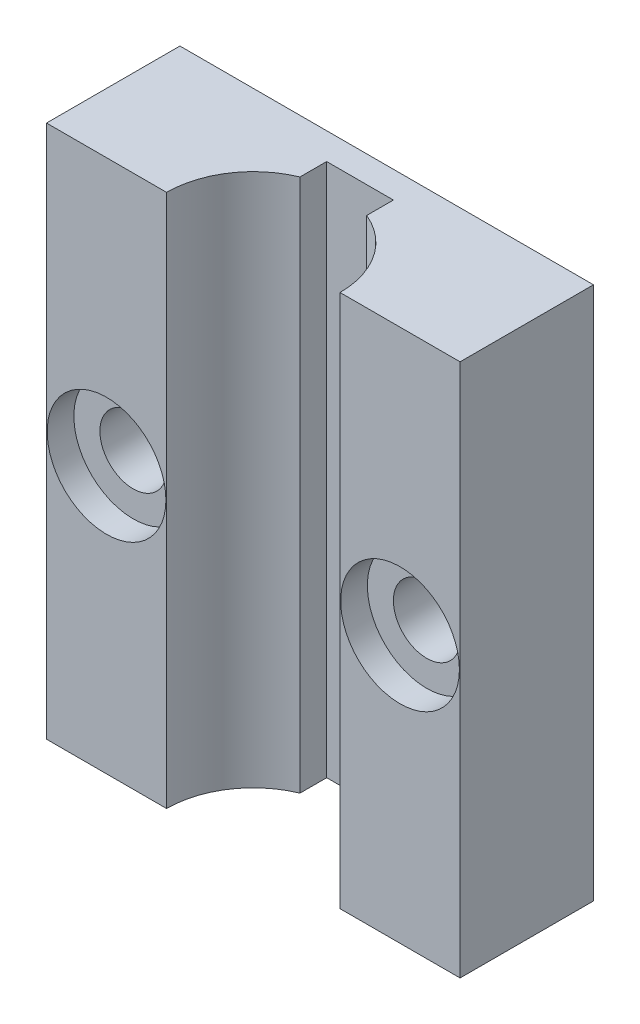
ISO-10303-21;
HEADER;
FILE_DESCRIPTION(('STEP AP214'),'2;1');
FILE_NAME('part.step','',(''),(''),'','','');
FILE_SCHEMA(('AUTOMOTIVE_DESIGN { 1 0 10303 214 1 1 1 1 }'));
ENDSEC;
DATA;
#1=APPLICATION_CONTEXT('core data for automotive mechanical design processes');
#2=APPLICATION_PROTOCOL_DEFINITION('international standard','automotive_design',2000,#1);
#3=PRODUCT_CONTEXT('',#1,'mechanical');
#4=PRODUCT('Part','Part','',(#3));
#5=PRODUCT_RELATED_PRODUCT_CATEGORY('part','',(#4));
#6=PRODUCT_DEFINITION_FORMATION('','',#4);
#7=PRODUCT_DEFINITION_CONTEXT('part definition',#1,'design');
#8=PRODUCT_DEFINITION('design','',#6,#7);
#9=PRODUCT_DEFINITION_SHAPE('','',#8);
#10=(LENGTH_UNIT() NAMED_UNIT(*) SI_UNIT(.MILLI.,.METRE.));
#11=(NAMED_UNIT(*) PLANE_ANGLE_UNIT() SI_UNIT($,.RADIAN.));
#12=(NAMED_UNIT(*) SI_UNIT($,.STERADIAN.) SOLID_ANGLE_UNIT());
#13=UNCERTAINTY_MEASURE_WITH_UNIT(LENGTH_MEASURE(1.E-05),#10,'distance_accuracy_value','');
#14=(GEOMETRIC_REPRESENTATION_CONTEXT(3) GLOBAL_UNCERTAINTY_ASSIGNED_CONTEXT((#13)) GLOBAL_UNIT_ASSIGNED_CONTEXT((#10,
#11,#12)) REPRESENTATION_CONTEXT('',''));
#15=CARTESIAN_POINT('',(0.,0.,0.));
#16=DIRECTION('',(0.,0.,1.));
#17=DIRECTION('',(1.,0.,0.));
#18=AXIS2_PLACEMENT_3D('',#15,#16,#17);
#19=CARTESIAN_POINT('',(-9.15448854262115,-16.4219409282701,10.));
#20=DIRECTION('',(0.,1.,0.));
#21=DIRECTION('',(0.,0.,1.));
#22=AXIS2_PLACEMENT_3D('',#19,#20,#21);
#23=CYLINDRICAL_SURFACE('',#22,6.5);
#24=CARTESIAN_POINT('',(-9.15448854262115,-16.4219409282701,10.));
#25=DIRECTION('',(0.,1.,0.));
#26=DIRECTION('',(0.,0.,1.));
#27=AXIS2_PLACEMENT_3D('',#24,#25,#26);
#28=CIRCLE('',#27,6.5);
#29=CARTESIAN_POINT('',(-11.6544885426211,-16.4219409282701,4.));
#30=VERTEX_POINT('',#29);
#31=CARTESIAN_POINT('',(-15.6544885426211,-16.4219409282701,10.));
#32=VERTEX_POINT('',#31);
#33=EDGE_CURVE('E168',#30,#32,#28,.T.);
#34=ORIENTED_EDGE('',*,*,#33,.F.);
#35=DIRECTION('',(0.,1.,0.));
#36=VECTOR('',#35,1.);
#37=CARTESIAN_POINT('',(-11.6544885426211,-16.4219409282701,4.));
#38=LINE('',#37,#36);
#39=CARTESIAN_POINT('',(-11.6544885426211,23.5780590717299,4.));
#40=VERTEX_POINT('',#39);
#41=EDGE_CURVE('E11',#30,#40,#38,.T.);
#42=ORIENTED_EDGE('',*,*,#41,.T.);
#43=CARTESIAN_POINT('',(-9.15448854262115,23.5780590717299,10.));
#44=DIRECTION('',(0.,1.,0.));
#45=DIRECTION('',(0.,0.,1.));
#46=AXIS2_PLACEMENT_3D('',#43,#44,#45);
#47=CIRCLE('',#46,6.5);
#48=CARTESIAN_POINT('',(-15.6544885426211,23.5780590717299,10.));
#49=VERTEX_POINT('',#48);
#50=EDGE_CURVE('E57',#40,#49,#47,.T.);
#51=ORIENTED_EDGE('',*,*,#50,.T.);
#52=DIRECTION('',(0.,1.,0.));
#53=VECTOR('',#52,1.);
#54=CARTESIAN_POINT('',(-15.6544885426211,-16.4219409282701,10.));
#55=LINE('',#54,#53);
#56=EDGE_CURVE('E206',#49,#32,#55,.F.);
#57=ORIENTED_EDGE('',*,*,#56,.T.);
#58=EDGE_LOOP('',(#34,#42,#51,#57));
#59=FACE_BOUND('',#58,.T.);
#60=ADVANCED_FACE('F35',(#59),#23,.F.);
#61=CARTESIAN_POINT('',(1.84551145737885,3.57805907172994,0.));
#62=DIRECTION('',(0.,0.,1.));
#63=DIRECTION('',(1.,0.,0.));
#64=AXIS2_PLACEMENT_3D('',#61,#62,#63);
#65=CYLINDRICAL_SURFACE('',#64,2.5);
#66=CARTESIAN_POINT('',(1.84551145737885,3.57805907172994,0.));
#67=DIRECTION('',(0.,0.,1.));
#68=DIRECTION('',(1.,0.,0.));
#69=AXIS2_PLACEMENT_3D('',#66,#67,#68);
#70=CIRCLE('',#69,2.5);
#71=CARTESIAN_POINT('',(4.34551145737885,3.57805907172994,0.));
#72=VERTEX_POINT('',#71);
#73=EDGE_CURVE('E151',#72,#72,#70,.T.);
#74=ORIENTED_EDGE('',*,*,#73,.F.);
#75=EDGE_LOOP('',(#74));
#76=FACE_BOUND('',#75,.T.);
#77=CARTESIAN_POINT('',(1.84551145737885,3.57805907172994,8.));
#78=DIRECTION('',(0.,0.,1.));
#79=DIRECTION('',(1.,0.,0.));
#80=AXIS2_PLACEMENT_3D('',#77,#78,#79);
#81=CIRCLE('',#80,2.5);
#82=CARTESIAN_POINT('',(4.34551145737885,3.57805907172994,8.));
#83=VERTEX_POINT('',#82);
#84=EDGE_CURVE('E141',#83,#83,#81,.T.);
#85=ORIENTED_EDGE('',*,*,#84,.T.);
#86=EDGE_LOOP('',(#85));
#87=FACE_BOUND('',#86,.T.);
#88=ADVANCED_FACE('F246',(#76,#87),#65,.F.);
#89=CARTESIAN_POINT('',(-20.1544885426211,3.57805907172994,0.));
#90=DIRECTION('',(0.,0.,1.));
#91=DIRECTION('',(1.,0.,0.));
#92=AXIS2_PLACEMENT_3D('',#89,#90,#91);
#93=CYLINDRICAL_SURFACE('',#92,2.5);
#94=CARTESIAN_POINT('',(-20.1544885426211,3.57805907172994,0.));
#95=DIRECTION('',(0.,0.,1.));
#96=DIRECTION('',(1.,0.,0.));
#97=AXIS2_PLACEMENT_3D('',#94,#95,#96);
#98=CIRCLE('',#97,2.5);
#99=CARTESIAN_POINT('',(-17.6544885426211,3.57805907172994,0.));
#100=VERTEX_POINT('',#99);
#101=EDGE_CURVE('E161',#100,#100,#98,.T.);
#102=ORIENTED_EDGE('',*,*,#101,.F.);
#103=EDGE_LOOP('',(#102));
#104=FACE_BOUND('',#103,.T.);
#105=CARTESIAN_POINT('',(-20.1544885426211,3.57805907172994,8.));
#106=DIRECTION('',(0.,0.,1.));
#107=DIRECTION('',(1.,0.,0.));
#108=AXIS2_PLACEMENT_3D('',#105,#106,#107);
#109=CIRCLE('',#108,2.5);
#110=CARTESIAN_POINT('',(-17.6544885426211,3.57805907172994,8.));
#111=VERTEX_POINT('',#110);
#112=EDGE_CURVE('E143',#111,#111,#109,.T.);
#113=ORIENTED_EDGE('',*,*,#112,.T.);
#114=EDGE_LOOP('',(#113));
#115=FACE_BOUND('',#114,.T.);
#116=ADVANCED_FACE('F239',(#104,#115),#93,.F.);
#117=CARTESIAN_POINT('',(0.,0.,10.));
#118=DIRECTION('',(0.,0.,1.));
#119=DIRECTION('',(1.,0.,0.));
#120=AXIS2_PLACEMENT_3D('',#117,#118,#119);
#121=PLANE('',#120);
#122=CARTESIAN_POINT('',(1.84551145737885,3.57805907172994,10.));
#123=DIRECTION('',(0.,0.,1.));
#124=DIRECTION('',(1.,0.,0.));
#125=AXIS2_PLACEMENT_3D('',#122,#123,#124);
#126=CIRCLE('',#125,4.45);
#127=CARTESIAN_POINT('',(6.29551145737885,3.57805907172994,10.));
#128=VERTEX_POINT('',#127);
#129=EDGE_CURVE('E156',#128,#128,#126,.T.);
#130=ORIENTED_EDGE('',*,*,#129,.F.);
#131=EDGE_LOOP('',(#130));
#132=FACE_BOUND('',#131,.T.);
#133=DIRECTION('',(0.,1.,0.));
#134=VECTOR('',#133,1.);
#135=CARTESIAN_POINT('',(-2.65448854262115,-16.4219409282701,10.));
#136=LINE('',#135,#134);
#137=CARTESIAN_POINT('',(-2.65448854262115,-16.4219409282701,10.));
#138=VERTEX_POINT('',#137);
#139=CARTESIAN_POINT('',(-2.65448854262115,23.5780590717299,10.));
#140=VERTEX_POINT('',#139);
#141=EDGE_CURVE('E208',#138,#140,#136,.T.);
#142=ORIENTED_EDGE('',*,*,#141,.F.);
#143=DIRECTION('',(1.,0.,0.));
#144=VECTOR('',#143,1.);
#145=CARTESIAN_POINT('',(-24.6544885426211,-16.4219409282701,10.));
#146=LINE('',#145,#144);
#147=CARTESIAN_POINT('',(6.34551145737886,-16.4219409282701,10.));
#148=VERTEX_POINT('',#147);
#149=EDGE_CURVE('E175',#138,#148,#146,.T.);
#150=ORIENTED_EDGE('',*,*,#149,.T.);
#151=DIRECTION('',(0.,-1.,0.));
#152=VECTOR('',#151,1.);
#153=CARTESIAN_POINT('',(6.34551145737885,23.5780590717299,10.));
#154=LINE('',#153,#152);
#155=CARTESIAN_POINT('',(6.34551145737885,23.5780590717299,10.));
#156=VERTEX_POINT('',#155);
#157=EDGE_CURVE('E180',#156,#148,#154,.T.);
#158=ORIENTED_EDGE('',*,*,#157,.F.);
#159=DIRECTION('',(1.,0.,0.));
#160=VECTOR('',#159,1.);
#161=CARTESIAN_POINT('',(-24.6544885426211,23.5780590717299,10.));
#162=LINE('',#161,#160);
#163=EDGE_CURVE('E183',#140,#156,#162,.T.);
#164=ORIENTED_EDGE('',*,*,#163,.F.);
#165=EDGE_LOOP('',(#142,#150,#158,#164));
#166=FACE_BOUND('',#165,.T.);
#167=ADVANCED_FACE('F237',(#132,#166),#121,.T.);
#168=CARTESIAN_POINT('',(-24.6544885426211,23.5780590717299,10.));
#169=DIRECTION('',(1.,0.,0.));
#170=DIRECTION('',(0.,0.,-1.));
#171=AXIS2_PLACEMENT_3D('',#168,#169,#170);
#172=PLANE('',#171);
#173=DIRECTION('',(0.,-1.,0.));
#174=VECTOR('',#173,1.);
#175=CARTESIAN_POINT('',(-24.6544885426211,23.5780590717299,0.));
#176=LINE('',#175,#174);
#177=CARTESIAN_POINT('',(-24.6544885426211,23.5780590717299,0.));
#178=VERTEX_POINT('',#177);
#179=CARTESIAN_POINT('',(-24.6544885426211,-16.4219409282701,0.));
#180=VERTEX_POINT('',#179);
#181=EDGE_CURVE('E167',#178,#180,#176,.T.);
#182=ORIENTED_EDGE('',*,*,#181,.T.);
#183=DIRECTION('',(0.,0.,-1.));
#184=VECTOR('',#183,1.);
#185=CARTESIAN_POINT('',(-24.6544885426211,-16.4219409282701,10.));
#186=LINE('',#185,#184);
#187=CARTESIAN_POINT('',(-24.6544885426211,-16.4219409282701,10.));
#188=VERTEX_POINT('',#187);
#189=EDGE_CURVE('E203',#188,#180,#186,.T.);
#190=ORIENTED_EDGE('',*,*,#189,.F.);
#191=DIRECTION('',(0.,-1.,0.));
#192=VECTOR('',#191,1.);
#193=CARTESIAN_POINT('',(-24.6544885426211,23.5780590717299,10.));
#194=LINE('',#193,#192);
#195=CARTESIAN_POINT('',(-24.6544885426211,23.5780590717299,10.));
#196=VERTEX_POINT('',#195);
#197=EDGE_CURVE('E172',#196,#188,#194,.T.);
#198=ORIENTED_EDGE('',*,*,#197,.F.);
#199=DIRECTION('',(0.,0.,-1.));
#200=VECTOR('',#199,1.);
#201=CARTESIAN_POINT('',(-24.6544885426211,23.5780590717299,10.));
#202=LINE('',#201,#200);
#203=EDGE_CURVE('E187',#196,#178,#202,.T.);
#204=ORIENTED_EDGE('',*,*,#203,.T.);
#205=EDGE_LOOP('',(#182,#190,#198,#204));
#206=FACE_BOUND('',#205,.T.);
#207=ADVANCED_FACE('F37',(#206),#172,.F.);
#208=CARTESIAN_POINT('',(-24.6544885426211,-16.4219409282701,10.));
#209=DIRECTION('',(0.,1.,0.));
#210=DIRECTION('',(0.,0.,1.));
#211=AXIS2_PLACEMENT_3D('',#208,#209,#210);
#212=PLANE('',#211);
#213=DIRECTION('',(-1.,0.,0.));
#214=VECTOR('',#213,1.);
#215=CARTESIAN_POINT('',(-11.6544885426211,-16.4219409282701,2.00000000000001));
#216=LINE('',#215,#214);
#217=CARTESIAN_POINT('',(-6.65448854262115,-16.4219409282701,2.00000000000001));
#218=VERTEX_POINT('',#217);
#219=CARTESIAN_POINT('',(-11.6544885426211,-16.4219409282701,2.00000000000001));
#220=VERTEX_POINT('',#219);
#221=EDGE_CURVE('E120',#218,#220,#216,.T.);
#222=ORIENTED_EDGE('',*,*,#221,.T.);
#223=DIRECTION('',(0.,0.,1.));
#224=VECTOR('',#223,1.);
#225=CARTESIAN_POINT('',(-11.6544885426211,-16.4219409282701,2.00000000000001));
#226=LINE('',#225,#224);
#227=EDGE_CURVE('E132',#220,#30,#226,.T.);
#228=ORIENTED_EDGE('',*,*,#227,.T.);
#229=ORIENTED_EDGE('',*,*,#33,.T.);
#230=EDGE_CURVE('E177',#188,#32,#146,.T.);
#231=ORIENTED_EDGE('',*,*,#230,.F.);
#232=ORIENTED_EDGE('',*,*,#189,.T.);
#233=DIRECTION('',(1.,0.,0.));
#234=VECTOR('',#233,1.);
#235=CARTESIAN_POINT('',(-24.6544885426211,-16.4219409282701,0.));
#236=LINE('',#235,#234);
#237=CARTESIAN_POINT('',(6.34551145737886,-16.4219409282701,0.));
#238=VERTEX_POINT('',#237);
#239=EDGE_CURVE('E190',#180,#238,#236,.T.);
#240=ORIENTED_EDGE('',*,*,#239,.T.);
#241=DIRECTION('',(0.,0.,-1.));
#242=VECTOR('',#241,1.);
#243=CARTESIAN_POINT('',(6.34551145737886,-16.4219409282701,10.));
#244=LINE('',#243,#242);
#245=EDGE_CURVE('E201',#148,#238,#244,.T.);
#246=ORIENTED_EDGE('',*,*,#245,.F.);
#247=ORIENTED_EDGE('',*,*,#149,.F.);
#248=CARTESIAN_POINT('',(-6.65448854262115,-16.4219409282701,4.));
#249=VERTEX_POINT('',#248);
#250=EDGE_CURVE('E131',#138,#249,#28,.T.);
#251=ORIENTED_EDGE('',*,*,#250,.T.);
#252=DIRECTION('',(0.,0.,-1.));
#253=VECTOR('',#252,1.);
#254=CARTESIAN_POINT('',(-6.65448854262115,-16.4219409282701,2.00000000000001));
#255=LINE('',#254,#253);
#256=EDGE_CURVE('E50',#249,#218,#255,.T.);
#257=ORIENTED_EDGE('',*,*,#256,.T.);
#258=EDGE_LOOP('',(#222,#228,#229,#231,#232,#240,#246,#247,#251,#257));
#259=FACE_BOUND('',#258,.T.);
#260=ADVANCED_FACE('F129',(#259),#212,.F.);
#261=CARTESIAN_POINT('',(6.34551145737885,23.5780590717299,10.));
#262=DIRECTION('',(1.,0.,0.));
#263=DIRECTION('',(0.,1.,0.));
#264=AXIS2_PLACEMENT_3D('',#261,#262,#263);
#265=PLANE('',#264);
#266=DIRECTION('',(0.,-1.,0.));
#267=VECTOR('',#266,1.);
#268=CARTESIAN_POINT('',(6.34551145737885,23.5780590717299,0.));
#269=LINE('',#268,#267);
#270=CARTESIAN_POINT('',(6.34551145737885,23.5780590717299,0.));
#271=VERTEX_POINT('',#270);
#272=EDGE_CURVE('E193',#271,#238,#269,.T.);
#273=ORIENTED_EDGE('',*,*,#272,.F.);
#274=DIRECTION('',(0.,0.,-1.));
#275=VECTOR('',#274,1.);
#276=CARTESIAN_POINT('',(6.34551145737885,23.5780590717299,10.));
#277=LINE('',#276,#275);
#278=EDGE_CURVE('E199',#156,#271,#277,.T.);
#279=ORIENTED_EDGE('',*,*,#278,.F.);
#280=ORIENTED_EDGE('',*,*,#157,.T.);
#281=ORIENTED_EDGE('',*,*,#245,.T.);
#282=EDGE_LOOP('',(#273,#279,#280,#281));
#283=FACE_BOUND('',#282,.T.);
#284=ADVANCED_FACE('F234',(#283),#265,.T.);
#285=CARTESIAN_POINT('',(-24.6544885426211,23.5780590717299,10.));
#286=DIRECTION('',(0.,1.,0.));
#287=DIRECTION('',(0.,0.,1.));
#288=AXIS2_PLACEMENT_3D('',#285,#286,#287);
#289=PLANE('',#288);
#290=DIRECTION('',(0.,0.,1.));
#291=VECTOR('',#290,1.);
#292=CARTESIAN_POINT('',(-11.6544885426211,23.5780590717299,2.00000000000001));
#293=LINE('',#292,#291);
#294=CARTESIAN_POINT('',(-11.6544885426211,23.5780590717299,2.00000000000001));
#295=VERTEX_POINT('',#294);
#296=EDGE_CURVE('E137',#295,#40,#293,.T.);
#297=ORIENTED_EDGE('',*,*,#296,.F.);
#298=DIRECTION('',(-1.,0.,0.));
#299=VECTOR('',#298,1.);
#300=CARTESIAN_POINT('',(-11.6544885426211,23.5780590717299,2.00000000000001));
#301=LINE('',#300,#299);
#302=CARTESIAN_POINT('',(-6.65448854262115,23.5780590717299,2.00000000000001));
#303=VERTEX_POINT('',#302);
#304=EDGE_CURVE('E134',#303,#295,#301,.T.);
#305=ORIENTED_EDGE('',*,*,#304,.F.);
#306=DIRECTION('',(0.,0.,-1.));
#307=VECTOR('',#306,1.);
#308=CARTESIAN_POINT('',(-6.65448854262115,23.5780590717299,2.00000000000001));
#309=LINE('',#308,#307);
#310=CARTESIAN_POINT('',(-6.65448854262115,23.5780590717299,4.));
#311=VERTEX_POINT('',#310);
#312=EDGE_CURVE('E115',#311,#303,#309,.T.);
#313=ORIENTED_EDGE('',*,*,#312,.F.);
#314=EDGE_CURVE('E169',#140,#311,#47,.T.);
#315=ORIENTED_EDGE('',*,*,#314,.F.);
#316=ORIENTED_EDGE('',*,*,#163,.T.);
#317=ORIENTED_EDGE('',*,*,#278,.T.);
#318=DIRECTION('',(1.,0.,0.));
#319=VECTOR('',#318,1.);
#320=CARTESIAN_POINT('',(-24.6544885426211,23.5780590717299,0.));
#321=LINE('',#320,#319);
#322=EDGE_CURVE('E176',#178,#271,#321,.T.);
#323=ORIENTED_EDGE('',*,*,#322,.F.);
#324=ORIENTED_EDGE('',*,*,#203,.F.);
#325=EDGE_CURVE('E184',#196,#49,#162,.T.);
#326=ORIENTED_EDGE('',*,*,#325,.T.);
#327=ORIENTED_EDGE('',*,*,#50,.F.);
#328=EDGE_LOOP('',(#297,#305,#313,#315,#316,#317,#323,#324,#326,#327));
#329=FACE_BOUND('',#328,.T.);
#330=ADVANCED_FACE('F215',(#329),#289,.T.);
#331=CARTESIAN_POINT('',(-20.1544885426211,3.57805907172994,10.));
#332=DIRECTION('',(0.,0.,1.));
#333=DIRECTION('',(1.,0.,0.));
#334=AXIS2_PLACEMENT_3D('',#331,#332,#333);
#335=CIRCLE('',#334,4.45);
#336=CARTESIAN_POINT('',(-15.7044885426211,3.57805907172994,10.));
#337=VERTEX_POINT('',#336);
#338=EDGE_CURVE('E146',#337,#337,#335,.T.);
#339=ORIENTED_EDGE('',*,*,#338,.F.);
#340=EDGE_LOOP('',(#339));
#341=FACE_BOUND('',#340,.T.);
#342=ORIENTED_EDGE('',*,*,#56,.F.);
#343=ORIENTED_EDGE('',*,*,#325,.F.);
#344=ORIENTED_EDGE('',*,*,#197,.T.);
#345=ORIENTED_EDGE('',*,*,#230,.T.);
#346=EDGE_LOOP('',(#342,#343,#344,#345));
#347=FACE_BOUND('',#346,.T.);
#348=ADVANCED_FACE('F224',(#341,#347),#121,.T.);
#349=CARTESIAN_POINT('',(0.,0.,0.));
#350=DIRECTION('',(0.,0.,1.));
#351=DIRECTION('',(1.,0.,0.));
#352=AXIS2_PLACEMENT_3D('',#349,#350,#351);
#353=PLANE('',#352);
#354=ORIENTED_EDGE('',*,*,#101,.T.);
#355=EDGE_LOOP('',(#354));
#356=FACE_BOUND('',#355,.T.);
#357=ORIENTED_EDGE('',*,*,#73,.T.);
#358=EDGE_LOOP('',(#357));
#359=FACE_BOUND('',#358,.T.);
#360=ORIENTED_EDGE('',*,*,#181,.F.);
#361=ORIENTED_EDGE('',*,*,#322,.T.);
#362=ORIENTED_EDGE('',*,*,#272,.T.);
#363=ORIENTED_EDGE('',*,*,#239,.F.);
#364=EDGE_LOOP('',(#360,#361,#362,#363));
#365=FACE_BOUND('',#364,.T.);
#366=ADVANCED_FACE('F229',(#356,#359,#365),#353,.F.);
#367=ORIENTED_EDGE('',*,*,#314,.T.);
#368=DIRECTION('',(0.,1.,0.));
#369=VECTOR('',#368,1.);
#370=CARTESIAN_POINT('',(-6.65448854262115,-16.4219409282701,4.));
#371=LINE('',#370,#369);
#372=EDGE_CURVE('E43',#311,#249,#371,.F.);
#373=ORIENTED_EDGE('',*,*,#372,.T.);
#374=ORIENTED_EDGE('',*,*,#250,.F.);
#375=ORIENTED_EDGE('',*,*,#141,.T.);
#376=EDGE_LOOP('',(#367,#373,#374,#375));
#377=FACE_BOUND('',#376,.T.);
#378=ADVANCED_FACE('F210',(#377),#23,.F.);
#379=CARTESIAN_POINT('',(-20.1544885426211,3.57805907172994,8.));
#380=DIRECTION('',(0.,0.,1.));
#381=DIRECTION('',(1.,0.,0.));
#382=AXIS2_PLACEMENT_3D('',#379,#380,#381);
#383=CYLINDRICAL_SURFACE('',#382,4.45);
#384=CARTESIAN_POINT('',(-20.1544885426211,3.57805907172994,8.));
#385=DIRECTION('',(0.,0.,1.));
#386=DIRECTION('',(1.,0.,0.));
#387=AXIS2_PLACEMENT_3D('',#384,#385,#386);
#388=CIRCLE('',#387,4.45);
#389=CARTESIAN_POINT('',(-15.7044885426211,3.57805907172994,8.));
#390=VERTEX_POINT('',#389);
#391=EDGE_CURVE('E148',#390,#390,#388,.T.);
#392=ORIENTED_EDGE('',*,*,#391,.F.);
#393=EDGE_LOOP('',(#392));
#394=FACE_BOUND('',#393,.T.);
#395=ORIENTED_EDGE('',*,*,#338,.T.);
#396=EDGE_LOOP('',(#395));
#397=FACE_BOUND('',#396,.T.);
#398=ADVANCED_FACE('F261',(#394,#397),#383,.F.);
#399=CARTESIAN_POINT('',(-20.1544885426211,3.57805907172994,8.));
#400=DIRECTION('',(0.,0.,1.));
#401=DIRECTION('',(1.,0.,0.));
#402=AXIS2_PLACEMENT_3D('',#399,#400,#401);
#403=PLANE('',#402);
#404=ORIENTED_EDGE('',*,*,#112,.F.);
#405=EDGE_LOOP('',(#404));
#406=FACE_BOUND('',#405,.T.);
#407=ORIENTED_EDGE('',*,*,#391,.T.);
#408=EDGE_LOOP('',(#407));
#409=FACE_BOUND('',#408,.T.);
#410=ADVANCED_FACE('F266',(#406,#409),#403,.T.);
#411=CARTESIAN_POINT('',(1.84551145737885,3.57805907172994,8.));
#412=DIRECTION('',(0.,0.,1.));
#413=DIRECTION('',(1.,0.,0.));
#414=AXIS2_PLACEMENT_3D('',#411,#412,#413);
#415=CYLINDRICAL_SURFACE('',#414,4.45);
#416=CARTESIAN_POINT('',(1.84551145737885,3.57805907172994,8.));
#417=DIRECTION('',(0.,0.,1.));
#418=DIRECTION('',(1.,0.,0.));
#419=AXIS2_PLACEMENT_3D('',#416,#417,#418);
#420=CIRCLE('',#419,4.45);
#421=CARTESIAN_POINT('',(6.29551145737885,3.57805907172994,8.));
#422=VERTEX_POINT('',#421);
#423=EDGE_CURVE('E147',#422,#422,#420,.T.);
#424=ORIENTED_EDGE('',*,*,#423,.F.);
#425=EDGE_LOOP('',(#424));
#426=FACE_BOUND('',#425,.T.);
#427=ORIENTED_EDGE('',*,*,#129,.T.);
#428=EDGE_LOOP('',(#427));
#429=FACE_BOUND('',#428,.T.);
#430=ADVANCED_FACE('F314',(#426,#429),#415,.F.);
#431=CARTESIAN_POINT('',(1.84551145737885,3.57805907172994,8.));
#432=DIRECTION('',(0.,0.,1.));
#433=DIRECTION('',(1.,0.,0.));
#434=AXIS2_PLACEMENT_3D('',#431,#432,#433);
#435=PLANE('',#434);
#436=ORIENTED_EDGE('',*,*,#84,.F.);
#437=EDGE_LOOP('',(#436));
#438=FACE_BOUND('',#437,.T.);
#439=ORIENTED_EDGE('',*,*,#423,.T.);
#440=EDGE_LOOP('',(#439));
#441=FACE_BOUND('',#440,.T.);
#442=ADVANCED_FACE('F324',(#438,#441),#435,.T.);
#443=CARTESIAN_POINT('',(-11.6544885426211,-16.4219409282701,2.00000000000001));
#444=DIRECTION('',(-1.,0.,0.));
#445=DIRECTION('',(0.,0.,1.));
#446=AXIS2_PLACEMENT_3D('',#443,#444,#445);
#447=PLANE('',#446);
#448=ORIENTED_EDGE('',*,*,#227,.F.);
#449=DIRECTION('',(0.,1.,0.));
#450=VECTOR('',#449,1.);
#451=CARTESIAN_POINT('',(-11.6544885426211,-16.4219409282701,2.00000000000001));
#452=LINE('',#451,#450);
#453=EDGE_CURVE('E119',#220,#295,#452,.T.);
#454=ORIENTED_EDGE('',*,*,#453,.T.);
#455=ORIENTED_EDGE('',*,*,#296,.T.);
#456=ORIENTED_EDGE('',*,*,#41,.F.);
#457=EDGE_LOOP('',(#448,#454,#455,#456));
#458=FACE_BOUND('',#457,.T.);
#459=ADVANCED_FACE('F218',(#458),#447,.F.);
#460=CARTESIAN_POINT('',(-6.65448854262115,-16.4219409282701,2.00000000000001));
#461=DIRECTION('',(1.,0.,0.));
#462=DIRECTION('',(0.,0.,-1.));
#463=AXIS2_PLACEMENT_3D('',#460,#461,#462);
#464=PLANE('',#463);
#465=ORIENTED_EDGE('',*,*,#312,.T.);
#466=DIRECTION('',(0.,1.,0.));
#467=VECTOR('',#466,1.);
#468=CARTESIAN_POINT('',(-6.65448854262115,-16.4219409282701,2.00000000000001));
#469=LINE('',#468,#467);
#470=EDGE_CURVE('E111',#218,#303,#469,.T.);
#471=ORIENTED_EDGE('',*,*,#470,.F.);
#472=ORIENTED_EDGE('',*,*,#256,.F.);
#473=ORIENTED_EDGE('',*,*,#372,.F.);
#474=EDGE_LOOP('',(#465,#471,#472,#473));
#475=FACE_BOUND('',#474,.T.);
#476=ADVANCED_FACE('F113',(#475),#464,.F.);
#477=CARTESIAN_POINT('',(-11.6544885426211,-16.4219409282701,2.00000000000001));
#478=DIRECTION('',(0.,0.,-1.));
#479=DIRECTION('',(-1.,0.,0.));
#480=AXIS2_PLACEMENT_3D('',#477,#478,#479);
#481=PLANE('',#480);
#482=ORIENTED_EDGE('',*,*,#304,.T.);
#483=ORIENTED_EDGE('',*,*,#453,.F.);
#484=ORIENTED_EDGE('',*,*,#221,.F.);
#485=ORIENTED_EDGE('',*,*,#470,.T.);
#486=EDGE_LOOP('',(#482,#483,#484,#485));
#487=FACE_BOUND('',#486,.T.);
#488=ADVANCED_FACE('F123',(#487),#481,.F.);
#489=CLOSED_SHELL('',(#60,#88,#116,#167,#207,#260,#284,#330,#348,#366,#378,#398,#410,#430,#442,
#459,#476,#488));
#490=MANIFOLD_SOLID_BREP('B2',#489);
#491=ADVANCED_BREP_SHAPE_REPRESENTATION('',(#18,#490),#14);
#492=SHAPE_DEFINITION_REPRESENTATION(#9,#491);
ENDSEC;
END-ISO-10303-21;
